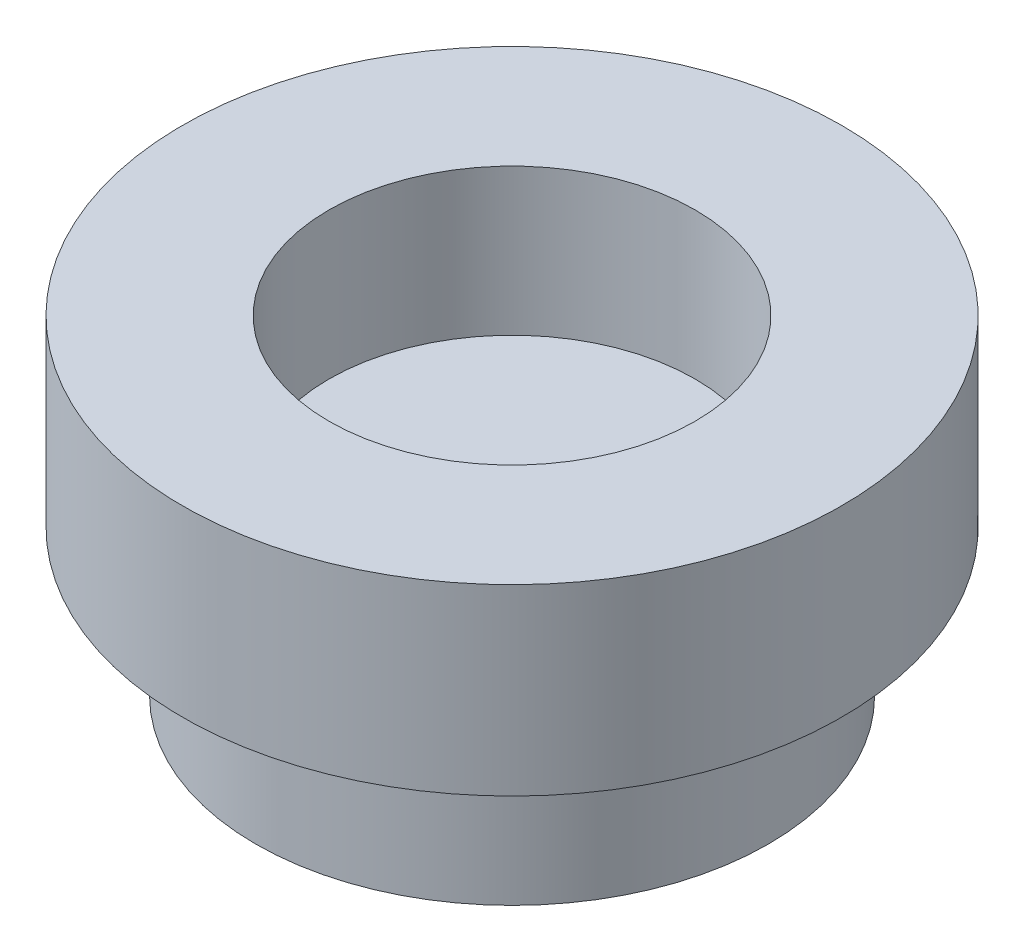
ISO-10303-21;
HEADER;
FILE_DESCRIPTION(('STEP AP214'),'2;1');
FILE_NAME('part.step','',(''),(''),'','','');
FILE_SCHEMA(('AUTOMOTIVE_DESIGN { 1 0 10303 214 1 1 1 1 }'));
ENDSEC;
DATA;
#1=APPLICATION_CONTEXT('core data for automotive mechanical design processes');
#2=APPLICATION_PROTOCOL_DEFINITION('international standard','automotive_design',2000,#1);
#3=PRODUCT_CONTEXT('',#1,'mechanical');
#4=PRODUCT('Part','Part','',(#3));
#5=PRODUCT_RELATED_PRODUCT_CATEGORY('part','',(#4));
#6=PRODUCT_DEFINITION_FORMATION('','',#4);
#7=PRODUCT_DEFINITION_CONTEXT('part definition',#1,'design');
#8=PRODUCT_DEFINITION('design','',#6,#7);
#9=PRODUCT_DEFINITION_SHAPE('','',#8);
#10=(LENGTH_UNIT() NAMED_UNIT(*) SI_UNIT(.MILLI.,.METRE.));
#11=(NAMED_UNIT(*) PLANE_ANGLE_UNIT() SI_UNIT($,.RADIAN.));
#12=(NAMED_UNIT(*) SI_UNIT($,.STERADIAN.) SOLID_ANGLE_UNIT());
#13=UNCERTAINTY_MEASURE_WITH_UNIT(LENGTH_MEASURE(1.E-05),#10,'distance_accuracy_value','');
#14=(GEOMETRIC_REPRESENTATION_CONTEXT(3) GLOBAL_UNCERTAINTY_ASSIGNED_CONTEXT((#13)) GLOBAL_UNIT_ASSIGNED_CONTEXT((#10,
#11,#12)) REPRESENTATION_CONTEXT('',''));
#15=CARTESIAN_POINT('',(0.,0.,0.));
#16=DIRECTION('',(0.,0.,1.));
#17=DIRECTION('',(1.,0.,0.));
#18=AXIS2_PLACEMENT_3D('',#15,#16,#17);
#19=CARTESIAN_POINT('',(0.,0.,5.));
#20=DIRECTION('',(0.,1.,0.));
#21=DIRECTION('',(0.,0.,1.));
#22=AXIS2_PLACEMENT_3D('',#19,#20,#21);
#23=PLANE('',#22);
#24=CARTESIAN_POINT('',(0.,0.,5.));
#25=DIRECTION('',(0.,-1.,0.));
#26=DIRECTION('',(0.,0.,-1.));
#27=AXIS2_PLACEMENT_3D('',#24,#25,#26);
#28=CIRCLE('',#27,3.5);
#29=CARTESIAN_POINT('',(0.,0.,1.5));
#30=VERTEX_POINT('',#29);
#31=EDGE_CURVE('E10',#30,#30,#28,.T.);
#32=ORIENTED_EDGE('',*,*,#31,.T.);
#33=EDGE_LOOP('',(#32));
#34=FACE_BOUND('',#33,.T.);
#35=ADVANCED_FACE('F31',(#34),#23,.F.);
#36=CARTESIAN_POINT('',(0.,0.,5.));
#37=DIRECTION('',(0.,-1.,0.));
#38=DIRECTION('',(0.,0.,-1.));
#39=AXIS2_PLACEMENT_3D('',#36,#37,#38);
#40=CYLINDRICAL_SURFACE('',#39,3.5);
#41=ORIENTED_EDGE('',*,*,#31,.F.);
#42=EDGE_LOOP('',(#41));
#43=FACE_BOUND('',#42,.T.);
#44=CARTESIAN_POINT('',(0.,2.,5.));
#45=DIRECTION('',(0.,-1.,0.));
#46=DIRECTION('',(0.,0.,-1.));
#47=AXIS2_PLACEMENT_3D('',#44,#45,#46);
#48=CIRCLE('',#47,3.5);
#49=CARTESIAN_POINT('',(0.,2.,1.5));
#50=VERTEX_POINT('',#49);
#51=EDGE_CURVE('E37',#50,#50,#48,.T.);
#52=ORIENTED_EDGE('',*,*,#51,.T.);
#53=EDGE_LOOP('',(#52));
#54=FACE_BOUND('',#53,.T.);
#55=ADVANCED_FACE('F69',(#43,#54),#40,.T.);
#56=CARTESIAN_POINT('',(0.,2.,8.5));
#57=DIRECTION('',(0.,1.,0.));
#58=DIRECTION('',(0.,0.,1.));
#59=AXIS2_PLACEMENT_3D('',#56,#57,#58);
#60=PLANE('',#59);
#61=ORIENTED_EDGE('',*,*,#51,.F.);
#62=EDGE_LOOP('',(#61));
#63=FACE_BOUND('',#62,.T.);
#64=CARTESIAN_POINT('',(0.,2.,5.));
#65=DIRECTION('',(0.,-1.,0.));
#66=DIRECTION('',(0.,0.,-1.));
#67=AXIS2_PLACEMENT_3D('',#64,#65,#66);
#68=CIRCLE('',#67,4.5);
#69=CARTESIAN_POINT('',(0.,2.,0.500000000000004));
#70=VERTEX_POINT('',#69);
#71=EDGE_CURVE('E41',#70,#70,#68,.T.);
#72=ORIENTED_EDGE('',*,*,#71,.T.);
#73=EDGE_LOOP('',(#72));
#74=FACE_BOUND('',#73,.T.);
#75=ADVANCED_FACE('F73',(#63,#74),#60,.F.);
#76=CARTESIAN_POINT('',(0.,0.,5.));
#77=DIRECTION('',(0.,-1.,0.));
#78=DIRECTION('',(0.,0.,-1.));
#79=AXIS2_PLACEMENT_3D('',#76,#77,#78);
#80=CYLINDRICAL_SURFACE('',#79,4.5);
#81=ORIENTED_EDGE('',*,*,#71,.F.);
#82=EDGE_LOOP('',(#81));
#83=FACE_BOUND('',#82,.T.);
#84=CARTESIAN_POINT('',(0.,4.5,5.));
#85=DIRECTION('',(0.,-1.,0.));
#86=DIRECTION('',(0.,0.,-1.));
#87=AXIS2_PLACEMENT_3D('',#84,#85,#86);
#88=CIRCLE('',#87,4.5);
#89=CARTESIAN_POINT('',(0.,4.5,0.500000000000004));
#90=VERTEX_POINT('',#89);
#91=EDGE_CURVE('E45',#90,#90,#88,.T.);
#92=ORIENTED_EDGE('',*,*,#91,.T.);
#93=EDGE_LOOP('',(#92));
#94=FACE_BOUND('',#93,.T.);
#95=ADVANCED_FACE('F78',(#83,#94),#80,.T.);
#96=CARTESIAN_POINT('',(0.,4.5,9.5));
#97=DIRECTION('',(0.,-1.,0.));
#98=DIRECTION('',(0.,0.,-1.));
#99=AXIS2_PLACEMENT_3D('',#96,#97,#98);
#100=PLANE('',#99);
#101=ORIENTED_EDGE('',*,*,#91,.F.);
#102=EDGE_LOOP('',(#101));
#103=FACE_BOUND('',#102,.T.);
#104=CARTESIAN_POINT('',(0.,4.5,5.));
#105=DIRECTION('',(0.,-1.,0.));
#106=DIRECTION('',(0.,0.,-1.));
#107=AXIS2_PLACEMENT_3D('',#104,#105,#106);
#108=CIRCLE('',#107,2.5);
#109=CARTESIAN_POINT('',(0.,4.5,2.5));
#110=VERTEX_POINT('',#109);
#111=EDGE_CURVE('E50',#110,#110,#108,.T.);
#112=ORIENTED_EDGE('',*,*,#111,.T.);
#113=EDGE_LOOP('',(#112));
#114=FACE_BOUND('',#113,.T.);
#115=ADVANCED_FACE('F65',(#103,#114),#100,.F.);
#116=CARTESIAN_POINT('',(0.,0.,5.));
#117=DIRECTION('',(0.,-1.,0.));
#118=DIRECTION('',(0.,0.,-1.));
#119=AXIS2_PLACEMENT_3D('',#116,#117,#118);
#120=CYLINDRICAL_SURFACE('',#119,2.5);
#121=ORIENTED_EDGE('',*,*,#111,.F.);
#122=EDGE_LOOP('',(#121));
#123=FACE_BOUND('',#122,.T.);
#124=CARTESIAN_POINT('',(0.,2.5,5.));
#125=DIRECTION('',(0.,-1.,0.));
#126=DIRECTION('',(0.,0.,-1.));
#127=AXIS2_PLACEMENT_3D('',#124,#125,#126);
#128=CIRCLE('',#127,2.5);
#129=CARTESIAN_POINT('',(0.,2.5,2.5));
#130=VERTEX_POINT('',#129);
#131=EDGE_CURVE('E53',#130,#130,#128,.T.);
#132=ORIENTED_EDGE('',*,*,#131,.T.);
#133=EDGE_LOOP('',(#132));
#134=FACE_BOUND('',#133,.T.);
#135=ADVANCED_FACE('F57',(#123,#134),#120,.F.);
#136=CARTESIAN_POINT('',(0.,2.5,7.5));
#137=DIRECTION('',(0.,-1.,0.));
#138=DIRECTION('',(0.,0.,-1.));
#139=AXIS2_PLACEMENT_3D('',#136,#137,#138);
#140=PLANE('',#139);
#141=ORIENTED_EDGE('',*,*,#131,.F.);
#142=EDGE_LOOP('',(#141));
#143=FACE_BOUND('',#142,.T.);
#144=ADVANCED_FACE('F59',(#143),#140,.F.);
#145=CLOSED_SHELL('',(#35,#55,#75,#95,#115,#135,#144));
#146=MANIFOLD_SOLID_BREP('B2',#145);
#147=ADVANCED_BREP_SHAPE_REPRESENTATION('',(#18,#146),#14);
#148=SHAPE_DEFINITION_REPRESENTATION(#9,#147);
ENDSEC;
END-ISO-10303-21;
